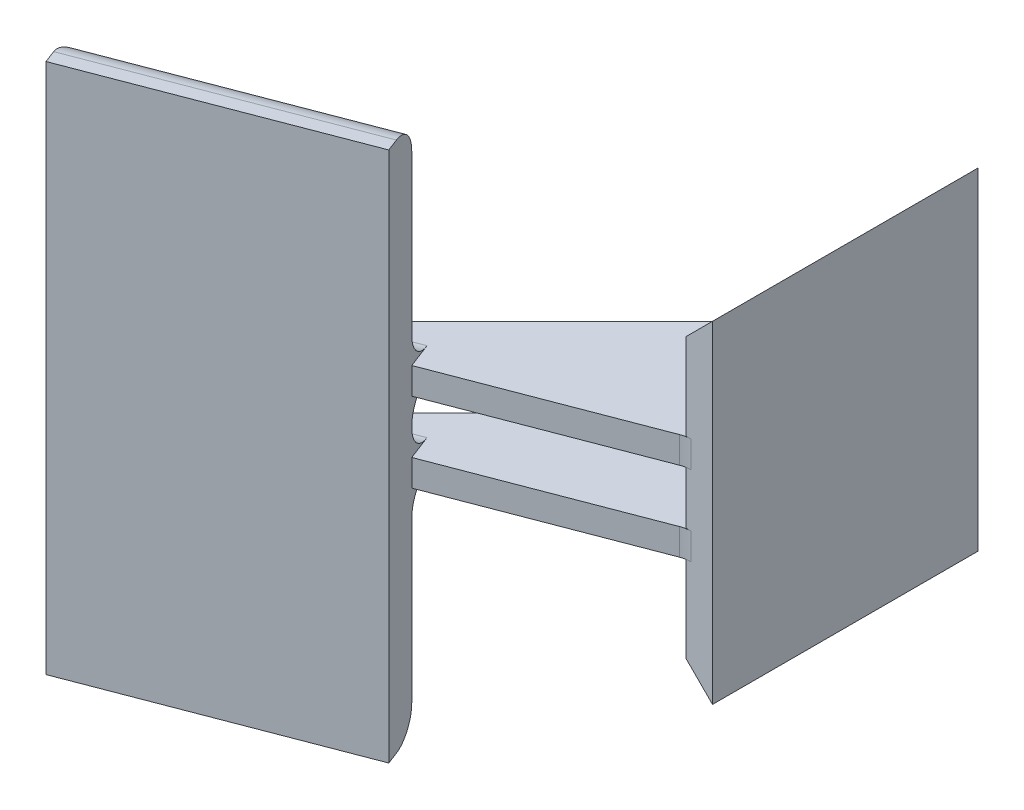
ISO-10303-21;
HEADER;
FILE_DESCRIPTION(('STEP AP214'),'2;1');
FILE_NAME('part.step','',(''),(''),'','','');
FILE_SCHEMA(('AUTOMOTIVE_DESIGN { 1 0 10303 214 1 1 1 1 }'));
ENDSEC;
DATA;
#1=APPLICATION_CONTEXT('core data for automotive mechanical design processes');
#2=APPLICATION_PROTOCOL_DEFINITION('international standard','automotive_design',2000,#1);
#3=PRODUCT_CONTEXT('',#1,'mechanical');
#4=PRODUCT('Part','Part','',(#3));
#5=PRODUCT_RELATED_PRODUCT_CATEGORY('part','',(#4));
#6=PRODUCT_DEFINITION_FORMATION('','',#4);
#7=PRODUCT_DEFINITION_CONTEXT('part definition',#1,'design');
#8=PRODUCT_DEFINITION('design','',#6,#7);
#9=PRODUCT_DEFINITION_SHAPE('','',#8);
#10=(LENGTH_UNIT() NAMED_UNIT(*) SI_UNIT(.MILLI.,.METRE.));
#11=(NAMED_UNIT(*) PLANE_ANGLE_UNIT() SI_UNIT($,.RADIAN.));
#12=(NAMED_UNIT(*) SI_UNIT($,.STERADIAN.) SOLID_ANGLE_UNIT());
#13=UNCERTAINTY_MEASURE_WITH_UNIT(LENGTH_MEASURE(1.E-05),#10,'distance_accuracy_value','');
#14=(GEOMETRIC_REPRESENTATION_CONTEXT(3) GLOBAL_UNCERTAINTY_ASSIGNED_CONTEXT((#13)) GLOBAL_UNIT_ASSIGNED_CONTEXT((#10,
#11,#12)) REPRESENTATION_CONTEXT('',''));
#15=CARTESIAN_POINT('',(0.,0.,0.));
#16=DIRECTION('',(0.,0.,1.));
#17=DIRECTION('',(1.,0.,0.));
#18=AXIS2_PLACEMENT_3D('',#15,#16,#17);
#19=CARTESIAN_POINT('',(0.,4.,10.));
#20=DIRECTION('',(-0.357131166599787,0.,-0.934054243522867));
#21=DIRECTION('',(-0.934054243522867,0.,0.357131166599787));
#22=AXIS2_PLACEMENT_3D('',#19,#20,#21);
#23=PLANE('',#22);
#24=DIRECTION('',(0.934054243522867,0.,-0.357131166599787));
#25=VECTOR('',#24,1.);
#26=CARTESIAN_POINT('',(0.,-4.,10.));
#27=LINE('',#26,#25);
#28=CARTESIAN_POINT('',(-14.9448678963659,-4.,15.7140986655966));
#29=VERTEX_POINT('',#28);
#30=CARTESIAN_POINT('',(-0.344954008165938,-4.,10.1318915129543));
#31=VERTEX_POINT('',#30);
#32=EDGE_CURVE('E306',#29,#31,#27,.T.);
#33=ORIENTED_EDGE('',*,*,#32,.T.);
#34=DIRECTION('',(0.,-1.,0.));
#35=VECTOR('',#34,1.);
#36=CARTESIAN_POINT('',(-0.344954008165938,-2.,10.1318915129543));
#37=LINE('',#36,#35);
#38=CARTESIAN_POINT('',(-0.344954008165938,-2.,10.1318915129543));
#39=VERTEX_POINT('',#38);
#40=EDGE_CURVE('E515',#31,#39,#37,.F.);
#41=ORIENTED_EDGE('',*,*,#40,.T.);
#42=DIRECTION('',(0.934054243522867,0.,-0.357131166599787));
#43=VECTOR('',#42,1.);
#44=CARTESIAN_POINT('',(0.,-2.,10.));
#45=LINE('',#44,#43);
#46=CARTESIAN_POINT('',(-14.9448678963659,-2.,15.7140986655966));
#47=VERTEX_POINT('',#46);
#48=EDGE_CURVE('E287',#47,#39,#45,.T.);
#49=ORIENTED_EDGE('',*,*,#48,.F.);
#50=DIRECTION('',(0.,1.,0.));
#51=VECTOR('',#50,1.);
#52=CARTESIAN_POINT('',(-14.9448678963659,-20.,15.7140986655966));
#53=LINE('',#52,#51);
#54=EDGE_CURVE('E536',#29,#47,#53,.T.);
#55=ORIENTED_EDGE('',*,*,#54,.F.);
#56=EDGE_LOOP('',(#33,#41,#49,#55));
#57=FACE_BOUND('',#56,.T.);
#58=ADVANCED_FACE('F47',(#57),#23,.F.);
#59=DIRECTION('',(0.934054243522867,0.,-0.357131166599787));
#60=VECTOR('',#59,1.);
#61=CARTESIAN_POINT('',(0.,2.,10.));
#62=LINE('',#61,#60);
#63=CARTESIAN_POINT('',(-14.9448678963659,2.,15.7140986655966));
#64=VERTEX_POINT('',#63);
#65=CARTESIAN_POINT('',(-0.344954008165938,2.,10.1318915129543));
#66=VERTEX_POINT('',#65);
#67=EDGE_CURVE('E283',#64,#66,#62,.T.);
#68=ORIENTED_EDGE('',*,*,#67,.T.);
#69=DIRECTION('',(0.,-1.,0.));
#70=VECTOR('',#69,1.);
#71=CARTESIAN_POINT('',(-0.344954008165938,4.,10.1318915129543));
#72=LINE('',#71,#70);
#73=CARTESIAN_POINT('',(-0.344954008165938,4.,10.1318915129543));
#74=VERTEX_POINT('',#73);
#75=EDGE_CURVE('E512',#66,#74,#72,.F.);
#76=ORIENTED_EDGE('',*,*,#75,.T.);
#77=DIRECTION('',(0.934054243522867,0.,-0.357131166599787));
#78=VECTOR('',#77,1.);
#79=CARTESIAN_POINT('',(0.,4.,10.));
#80=LINE('',#79,#78);
#81=CARTESIAN_POINT('',(-14.9448678963659,4.,15.7140986655966));
#82=VERTEX_POINT('',#81);
#83=EDGE_CURVE('E310',#82,#74,#80,.T.);
#84=ORIENTED_EDGE('',*,*,#83,.F.);
#85=EDGE_CURVE('E560',#64,#82,#53,.T.);
#86=ORIENTED_EDGE('',*,*,#85,.F.);
#87=EDGE_LOOP('',(#68,#76,#84,#86));
#88=FACE_BOUND('',#87,.T.);
#89=ADVANCED_FACE('F611',(#88),#23,.F.);
#90=CARTESIAN_POINT('',(0.,4.,-4.99999999999999));
#91=DIRECTION('',(0.707106781186546,0.,0.707106781186549));
#92=DIRECTION('',(0.707106781186549,0.,-0.707106781186546));
#93=AXIS2_PLACEMENT_3D('',#90,#91,#92);
#94=PLANE('',#93);
#95=CARTESIAN_POINT('',(-20.8187436649279,-6.,15.8187436649278));
#96=DIRECTION('',(0.707106781186546,0.,0.707106781186549));
#97=DIRECTION('',(-0.707106781186549,0.,0.707106781186546));
#98=AXIS2_PLACEMENT_3D('',#95,#96,#97);
#99=ELLIPSE('',#98,4.90260701622672,2.);
#100=CARTESIAN_POINT('',(-20.8187436649279,-4.,15.8187436649278));
#101=VERTEX_POINT('',#100);
#102=CARTESIAN_POINT('',(-23.9838309903863,-5.18410756016937,18.9838309903863));
#103=VERTEX_POINT('',#102);
#104=EDGE_CURVE('E433',#101,#103,#99,.T.);
#105=ORIENTED_EDGE('',*,*,#104,.T.);
#106=DIRECTION('',(0.,-1.,0.));
#107=VECTOR('',#106,1.);
#108=CARTESIAN_POINT('',(-23.9838309903863,-2.,18.9838309903863));
#109=LINE('',#108,#107);
#110=CARTESIAN_POINT('',(-23.9838309903863,-0.815892439830626,18.9838309903863));
#111=VERTEX_POINT('',#110);
#112=EDGE_CURVE('E407',#103,#111,#109,.F.);
#113=ORIENTED_EDGE('',*,*,#112,.T.);
#114=CARTESIAN_POINT('',(-20.8187436649279,0.,15.8187436649278));
#115=DIRECTION('',(0.707106781186546,0.,0.707106781186549));
#116=DIRECTION('',(0.707106781186549,0.,-0.707106781186546));
#117=AXIS2_PLACEMENT_3D('',#114,#115,#116);
#118=ELLIPSE('',#117,4.90260701622672,2.);
#119=CARTESIAN_POINT('',(-20.8187436649279,-2.,15.8187436649278));
#120=VERTEX_POINT('',#119);
#121=EDGE_CURVE('E440',#111,#120,#118,.T.);
#122=ORIENTED_EDGE('',*,*,#121,.T.);
#123=DIRECTION('',(-0.707106781186549,0.,0.707106781186546));
#124=VECTOR('',#123,1.);
#125=CARTESIAN_POINT('',(0.,-2.,-4.99999999999999));
#126=LINE('',#125,#124);
#127=CARTESIAN_POINT('',(0.,-2.,-4.99999999999999));
#128=VERTEX_POINT('',#127);
#129=EDGE_CURVE('E282',#128,#120,#126,.T.);
#130=ORIENTED_EDGE('',*,*,#129,.F.);
#131=DIRECTION('',(0.,-1.,0.));
#132=VECTOR('',#131,1.);
#133=CARTESIAN_POINT('',(0.,4.,-4.99999999999999));
#134=LINE('',#133,#132);
#135=CARTESIAN_POINT('',(0.,-4.,-4.99999999999999));
#136=VERTEX_POINT('',#135);
#137=EDGE_CURVE('E314',#128,#136,#134,.T.);
#138=ORIENTED_EDGE('',*,*,#137,.T.);
#139=DIRECTION('',(-0.707106781186549,0.,0.707106781186546));
#140=VECTOR('',#139,1.);
#141=CARTESIAN_POINT('',(0.,-4.,-4.99999999999999));
#142=LINE('',#141,#140);
#143=EDGE_CURVE('E318',#136,#101,#142,.T.);
#144=ORIENTED_EDGE('',*,*,#143,.T.);
#145=EDGE_LOOP('',(#105,#113,#122,#130,#138,#144));
#146=FACE_BOUND('',#145,.T.);
#147=ADVANCED_FACE('F550',(#146),#94,.F.);
#148=CARTESIAN_POINT('',(2.,-12.5,9.99999999999999));
#149=DIRECTION('',(0.,0.,-1.));
#150=DIRECTION('',(-1.,0.,0.));
#151=AXIS2_PLACEMENT_3D('',#148,#149,#150);
#152=PLANE('',#151);
#153=DIRECTION('',(0.,-1.,0.));
#154=VECTOR('',#153,1.);
#155=CARTESIAN_POINT('',(0.369308325033637,2.,9.99999999999999));
#156=LINE('',#155,#154);
#157=CARTESIAN_POINT('',(0.369308325033637,4.,9.99999999999999));
#158=VERTEX_POINT('',#157);
#159=CARTESIAN_POINT('',(0.369308325033637,2.,9.99999999999999));
#160=VERTEX_POINT('',#159);
#161=EDGE_CURVE('E505',#158,#160,#156,.T.);
#162=ORIENTED_EDGE('',*,*,#161,.T.);
#163=DIRECTION('',(-1.,0.,0.));
#164=VECTOR('',#163,1.);
#165=CARTESIAN_POINT('',(0.,2.,9.99999999999999));
#166=LINE('',#165,#164);
#167=CARTESIAN_POINT('',(0.,2.,10.));
#168=VERTEX_POINT('',#167);
#169=EDGE_CURVE('E509',#160,#168,#166,.T.);
#170=ORIENTED_EDGE('',*,*,#169,.T.);
#171=DIRECTION('',(0.,1.,0.));
#172=VECTOR('',#171,1.);
#173=CARTESIAN_POINT('',(0.,-2.,10.));
#174=LINE('',#173,#172);
#175=CARTESIAN_POINT('',(0.,-2.,10.));
#176=VERTEX_POINT('',#175);
#177=EDGE_CURVE('E290',#176,#168,#174,.T.);
#178=ORIENTED_EDGE('',*,*,#177,.F.);
#179=DIRECTION('',(1.,0.,0.));
#180=VECTOR('',#179,1.);
#181=CARTESIAN_POINT('',(2.,-2.,9.99999999999999));
#182=LINE('',#181,#180);
#183=CARTESIAN_POINT('',(0.369308325033637,-2.,9.99999999999999));
#184=VERTEX_POINT('',#183);
#185=EDGE_CURVE('E62',#176,#184,#182,.T.);
#186=ORIENTED_EDGE('',*,*,#185,.T.);
#187=DIRECTION('',(0.,-1.,0.));
#188=VECTOR('',#187,1.);
#189=CARTESIAN_POINT('',(0.369308325033637,-4.,9.99999999999999));
#190=LINE('',#189,#188);
#191=CARTESIAN_POINT('',(0.369308325033637,-4.,9.99999999999999));
#192=VERTEX_POINT('',#191);
#193=EDGE_CURVE('E496',#184,#192,#190,.T.);
#194=ORIENTED_EDGE('',*,*,#193,.T.);
#195=DIRECTION('',(-1.,0.,0.));
#196=VECTOR('',#195,1.);
#197=CARTESIAN_POINT('',(0.,-4.,9.99999999999999));
#198=LINE('',#197,#196);
#199=CARTESIAN_POINT('',(0.,-4.,9.99999999999999));
#200=VERTEX_POINT('',#199);
#201=EDGE_CURVE('E500',#192,#200,#198,.T.);
#202=ORIENTED_EDGE('',*,*,#201,.T.);
#203=DIRECTION('',(0.,-1.,0.));
#204=VECTOR('',#203,1.);
#205=CARTESIAN_POINT('',(0.,-12.5,9.99999999999999));
#206=LINE('',#205,#204);
#207=CARTESIAN_POINT('',(0.,-10.5,9.99999999999999));
#208=VERTEX_POINT('',#207);
#209=EDGE_CURVE('E329',#200,#208,#206,.T.);
#210=ORIENTED_EDGE('',*,*,#209,.T.);
#211=DIRECTION('',(-0.707106781186546,0.707106781186549,0.));
#212=VECTOR('',#211,1.);
#213=CARTESIAN_POINT('',(1.99999999999999,-12.5,9.99999999999999));
#214=LINE('',#213,#212);
#215=CARTESIAN_POINT('',(2.,-12.5,9.99999999999999));
#216=VERTEX_POINT('',#215);
#217=EDGE_CURVE('E485',#208,#216,#214,.F.);
#218=ORIENTED_EDGE('',*,*,#217,.T.);
#219=DIRECTION('',(0.,-1.,0.));
#220=VECTOR('',#219,1.);
#221=CARTESIAN_POINT('',(2.,-12.5,9.99999999999999));
#222=LINE('',#221,#220);
#223=CARTESIAN_POINT('',(2.,12.5,9.99999999999999));
#224=VERTEX_POINT('',#223);
#225=EDGE_CURVE('E334',#224,#216,#222,.T.);
#226=ORIENTED_EDGE('',*,*,#225,.F.);
#227=DIRECTION('',(0.707106781186546,0.707106781186549,0.));
#228=VECTOR('',#227,1.);
#229=CARTESIAN_POINT('',(1.99999999999999,12.5,9.99999999999999));
#230=LINE('',#229,#228);
#231=CARTESIAN_POINT('',(0.,10.5,9.99999999999999));
#232=VERTEX_POINT('',#231);
#233=EDGE_CURVE('E482',#224,#232,#230,.F.);
#234=ORIENTED_EDGE('',*,*,#233,.T.);
#235=CARTESIAN_POINT('',(0.,4.,9.99999999999999));
#236=VERTEX_POINT('',#235);
#237=EDGE_CURVE('E335',#232,#236,#206,.T.);
#238=ORIENTED_EDGE('',*,*,#237,.T.);
#239=DIRECTION('',(1.,0.,0.));
#240=VECTOR('',#239,1.);
#241=CARTESIAN_POINT('',(2.,4.,9.99999999999999));
#242=LINE('',#241,#240);
#243=EDGE_CURVE('E70',#236,#158,#242,.T.);
#244=ORIENTED_EDGE('',*,*,#243,.T.);
#245=EDGE_LOOP('',(#162,#170,#178,#186,#194,#202,#210,#218,#226,#234,#238,#244));
#246=FACE_BOUND('',#245,.T.);
#247=ADVANCED_FACE('F540',(#246),#152,.F.);
#248=CARTESIAN_POINT('',(2.,0.,0.));
#249=DIRECTION('',(1.,0.,0.));
#250=DIRECTION('',(0.,0.,-1.));
#251=AXIS2_PLACEMENT_3D('',#248,#249,#250);
#252=PLANE('',#251);
#253=DIRECTION('',(0.,0.,1.));
#254=VECTOR('',#253,1.);
#255=CARTESIAN_POINT('',(2.,12.5,9.99999999999999));
#256=LINE('',#255,#254);
#257=CARTESIAN_POINT('',(2.,12.5,-10.));
#258=VERTEX_POINT('',#257);
#259=EDGE_CURVE('E330',#258,#224,#256,.T.);
#260=ORIENTED_EDGE('',*,*,#259,.T.);
#261=ORIENTED_EDGE('',*,*,#225,.T.);
#262=DIRECTION('',(0.,0.,-1.));
#263=VECTOR('',#262,1.);
#264=CARTESIAN_POINT('',(2.,-12.5,9.99999999999999));
#265=LINE('',#264,#263);
#266=CARTESIAN_POINT('',(2.,-12.5,-10.));
#267=VERTEX_POINT('',#266);
#268=EDGE_CURVE('E339',#216,#267,#265,.T.);
#269=ORIENTED_EDGE('',*,*,#268,.T.);
#270=DIRECTION('',(0.,1.,0.));
#271=VECTOR('',#270,1.);
#272=CARTESIAN_POINT('',(2.,-12.5,-10.));
#273=LINE('',#272,#271);
#274=EDGE_CURVE('E343',#267,#258,#273,.T.);
#275=ORIENTED_EDGE('',*,*,#274,.T.);
#276=EDGE_LOOP('',(#260,#261,#269,#275));
#277=FACE_BOUND('',#276,.T.);
#278=ADVANCED_FACE('F626',(#277),#252,.T.);
#279=CARTESIAN_POINT('',(0.,0.,0.));
#280=DIRECTION('',(1.,0.,0.));
#281=DIRECTION('',(0.,0.,-1.));
#282=AXIS2_PLACEMENT_3D('',#279,#280,#281);
#283=PLANE('',#282);
#284=DIRECTION('',(0.,-1.,0.));
#285=VECTOR('',#284,1.);
#286=CARTESIAN_POINT('',(0.,0.,-8.00000000000001));
#287=LINE('',#286,#285);
#288=CARTESIAN_POINT('',(0.,10.5,-8.00000000000001));
#289=VERTEX_POINT('',#288);
#290=CARTESIAN_POINT('',(0.,-10.5,-8.00000000000001));
#291=VERTEX_POINT('',#290);
#292=EDGE_CURVE('E476',#289,#291,#287,.T.);
#293=ORIENTED_EDGE('',*,*,#292,.T.);
#294=DIRECTION('',(0.,0.,1.));
#295=VECTOR('',#294,1.);
#296=CARTESIAN_POINT('',(0.,-10.5,0.));
#297=LINE('',#296,#295);
#298=EDGE_CURVE('E479',#291,#208,#297,.T.);
#299=ORIENTED_EDGE('',*,*,#298,.T.);
#300=ORIENTED_EDGE('',*,*,#209,.F.);
#301=DIRECTION('',(0.,0.,-1.));
#302=VECTOR('',#301,1.);
#303=CARTESIAN_POINT('',(0.,-4.,10.));
#304=LINE('',#303,#302);
#305=EDGE_CURVE('E301',#200,#136,#304,.T.);
#306=ORIENTED_EDGE('',*,*,#305,.T.);
#307=ORIENTED_EDGE('',*,*,#137,.F.);
#308=DIRECTION('',(0.,0.,-1.));
#309=VECTOR('',#308,1.);
#310=CARTESIAN_POINT('',(0.,-2.,10.));
#311=LINE('',#310,#309);
#312=EDGE_CURVE('E279',#176,#128,#311,.T.);
#313=ORIENTED_EDGE('',*,*,#312,.F.);
#314=ORIENTED_EDGE('',*,*,#177,.T.);
#315=DIRECTION('',(0.,0.,-1.));
#316=VECTOR('',#315,1.);
#317=CARTESIAN_POINT('',(0.,2.,10.));
#318=LINE('',#317,#316);
#319=CARTESIAN_POINT('',(0.,2.,-4.99999999999999));
#320=VERTEX_POINT('',#319);
#321=EDGE_CURVE('E268',#168,#320,#318,.T.);
#322=ORIENTED_EDGE('',*,*,#321,.T.);
#323=CARTESIAN_POINT('',(0.,4.,-4.99999999999999));
#324=VERTEX_POINT('',#323);
#325=EDGE_CURVE('E325',#324,#320,#134,.T.);
#326=ORIENTED_EDGE('',*,*,#325,.F.);
#327=DIRECTION('',(0.,0.,-1.));
#328=VECTOR('',#327,1.);
#329=CARTESIAN_POINT('',(0.,4.,10.));
#330=LINE('',#329,#328);
#331=EDGE_CURVE('E302',#236,#324,#330,.T.);
#332=ORIENTED_EDGE('',*,*,#331,.F.);
#333=ORIENTED_EDGE('',*,*,#237,.F.);
#334=DIRECTION('',(0.,0.,-1.));
#335=VECTOR('',#334,1.);
#336=CARTESIAN_POINT('',(0.,10.5,0.));
#337=LINE('',#336,#335);
#338=EDGE_CURVE('E443',#232,#289,#337,.T.);
#339=ORIENTED_EDGE('',*,*,#338,.T.);
#340=EDGE_LOOP('',(#293,#299,#300,#306,#307,#313,#314,#322,#326,#332,#333,#339));
#341=FACE_BOUND('',#340,.T.);
#342=ADVANCED_FACE('F546',(#341),#283,.F.);
#343=DIRECTION('',(-0.707106781186549,0.,0.707106781186546));
#344=VECTOR('',#343,1.);
#345=CARTESIAN_POINT('',(0.,2.,-4.99999999999999));
#346=LINE('',#345,#344);
#347=CARTESIAN_POINT('',(-20.8187436649279,2.,15.8187436649278));
#348=VERTEX_POINT('',#347);
#349=EDGE_CURVE('E273',#320,#348,#346,.T.);
#350=ORIENTED_EDGE('',*,*,#349,.T.);
#351=CARTESIAN_POINT('',(-20.8187436649279,0.,15.8187436649278));
#352=DIRECTION('',(0.707106781186546,0.,0.707106781186549));
#353=DIRECTION('',(-0.707106781186549,0.,0.707106781186546));
#354=AXIS2_PLACEMENT_3D('',#351,#352,#353);
#355=ELLIPSE('',#354,4.90260701622672,2.);
#356=CARTESIAN_POINT('',(-23.9838309903863,0.815892439830626,18.9838309903863));
#357=VERTEX_POINT('',#356);
#358=EDGE_CURVE('E426',#348,#357,#355,.T.);
#359=ORIENTED_EDGE('',*,*,#358,.T.);
#360=DIRECTION('',(0.,-1.,0.));
#361=VECTOR('',#360,1.);
#362=CARTESIAN_POINT('',(-23.9838309903863,4.,18.9838309903863));
#363=LINE('',#362,#361);
#364=CARTESIAN_POINT('',(-23.9838309903863,5.18410756016937,18.9838309903863));
#365=VERTEX_POINT('',#364);
#366=EDGE_CURVE('E390',#357,#365,#363,.F.);
#367=ORIENTED_EDGE('',*,*,#366,.T.);
#368=CARTESIAN_POINT('',(-20.8187436649279,6.,15.8187436649278));
#369=DIRECTION('',(0.707106781186546,0.,0.707106781186549));
#370=DIRECTION('',(0.707106781186549,0.,-0.707106781186546));
#371=AXIS2_PLACEMENT_3D('',#368,#369,#370);
#372=ELLIPSE('',#371,4.90260701622672,2.);
#373=CARTESIAN_POINT('',(-20.8187436649279,4.,15.8187436649278));
#374=VERTEX_POINT('',#373);
#375=EDGE_CURVE('E420',#365,#374,#372,.T.);
#376=ORIENTED_EDGE('',*,*,#375,.T.);
#377=DIRECTION('',(-0.707106781186549,0.,0.707106781186546));
#378=VECTOR('',#377,1.);
#379=CARTESIAN_POINT('',(0.,4.,-4.99999999999999));
#380=LINE('',#379,#378);
#381=EDGE_CURVE('E305',#324,#374,#380,.T.);
#382=ORIENTED_EDGE('',*,*,#381,.F.);
#383=ORIENTED_EDGE('',*,*,#325,.T.);
#384=EDGE_LOOP('',(#350,#359,#367,#376,#382,#383));
#385=FACE_BOUND('',#384,.T.);
#386=ADVANCED_FACE('F621',(#385),#94,.F.);
#387=CARTESIAN_POINT('',(0.,4.,0.));
#388=DIRECTION('',(0.,1.,0.));
#389=DIRECTION('',(0.,0.,1.));
#390=AXIS2_PLACEMENT_3D('',#387,#388,#389);
#391=PLANE('',#390);
#392=ORIENTED_EDGE('',*,*,#381,.T.);
#393=DIRECTION('',(0.934054243522867,0.,-0.357131166599787));
#394=VECTOR('',#393,1.);
#395=CARTESIAN_POINT('',(2.62153648336846,4.,6.85646481138502));
#396=LINE('',#395,#394);
#397=CARTESIAN_POINT('',(-15.6591302295654,4.,13.8459901785509));
#398=VERTEX_POINT('',#397);
#399=EDGE_CURVE('E386',#374,#398,#396,.T.);
#400=ORIENTED_EDGE('',*,*,#399,.T.);
#401=DIRECTION('',(0.357131166599787,0.,0.934054243522867));
#402=VECTOR('',#401,1.);
#403=CARTESIAN_POINT('',(-18.2806667129339,4.,6.98952536716585));
#404=LINE('',#403,#402);
#405=EDGE_CURVE('E383',#398,#82,#404,.T.);
#406=ORIENTED_EDGE('',*,*,#405,.T.);
#407=ORIENTED_EDGE('',*,*,#83,.T.);
#408=CARTESIAN_POINT('',(0.369308325033637,4.,12.));
#409=DIRECTION('',(0.,1.,0.));
#410=DIRECTION('',(0.,0.,1.));
#411=AXIS2_PLACEMENT_3D('',#408,#409,#410);
#412=CIRCLE('',#411,2.);
#413=EDGE_CURVE('E521',#74,#158,#412,.F.);
#414=ORIENTED_EDGE('',*,*,#413,.T.);
#415=ORIENTED_EDGE('',*,*,#243,.F.);
#416=ORIENTED_EDGE('',*,*,#331,.T.);
#417=EDGE_LOOP('',(#392,#400,#406,#407,#414,#415,#416));
#418=FACE_BOUND('',#417,.T.);
#419=ADVANCED_FACE('F624',(#418),#391,.T.);
#420=CARTESIAN_POINT('',(0.,-4.,0.));
#421=DIRECTION('',(0.,1.,0.));
#422=DIRECTION('',(0.,0.,1.));
#423=AXIS2_PLACEMENT_3D('',#420,#421,#422);
#424=PLANE('',#423);
#425=ORIENTED_EDGE('',*,*,#32,.F.);
#426=DIRECTION('',(-0.357131166599787,0.,-0.934054243522867));
#427=VECTOR('',#426,1.);
#428=CARTESIAN_POINT('',(-13.8734743965665,-4.,18.5162613961652));
#429=LINE('',#428,#427);
#430=CARTESIAN_POINT('',(-15.6591302295654,-4.,13.8459901785509));
#431=VERTEX_POINT('',#430);
#432=EDGE_CURVE('E403',#29,#431,#429,.T.);
#433=ORIENTED_EDGE('',*,*,#432,.T.);
#434=DIRECTION('',(0.934054243522867,0.,-0.357131166599787));
#435=VECTOR('',#434,1.);
#436=CARTESIAN_POINT('',(-24.9996726647941,-4.,17.4173018445487));
#437=LINE('',#436,#435);
#438=EDGE_CURVE('E400',#431,#101,#437,.F.);
#439=ORIENTED_EDGE('',*,*,#438,.T.);
#440=ORIENTED_EDGE('',*,*,#143,.F.);
#441=ORIENTED_EDGE('',*,*,#305,.F.);
#442=ORIENTED_EDGE('',*,*,#201,.F.);
#443=CARTESIAN_POINT('',(0.369308325033637,-4.,12.));
#444=DIRECTION('',(0.,1.,0.));
#445=DIRECTION('',(0.,0.,1.));
#446=AXIS2_PLACEMENT_3D('',#443,#444,#445);
#447=CIRCLE('',#446,2.);
#448=EDGE_CURVE('E56',#192,#31,#447,.T.);
#449=ORIENTED_EDGE('',*,*,#448,.T.);
#450=EDGE_LOOP('',(#425,#433,#439,#440,#441,#442,#449));
#451=FACE_BOUND('',#450,.T.);
#452=ADVANCED_FACE('F527',(#451),#424,.F.);
#453=CARTESIAN_POINT('',(0.,-2.,0.));
#454=DIRECTION('',(0.,1.,0.));
#455=DIRECTION('',(0.,0.,1.));
#456=AXIS2_PLACEMENT_3D('',#453,#454,#455);
#457=PLANE('',#456);
#458=ORIENTED_EDGE('',*,*,#129,.T.);
#459=DIRECTION('',(0.934054243522867,0.,-0.357131166599787));
#460=VECTOR('',#459,1.);
#461=CARTESIAN_POINT('',(2.62153648336846,-2.,6.85646481138502));
#462=LINE('',#461,#460);
#463=CARTESIAN_POINT('',(-15.6591302295654,-2.,13.8459901785509));
#464=VERTEX_POINT('',#463);
#465=EDGE_CURVE('E413',#120,#464,#462,.T.);
#466=ORIENTED_EDGE('',*,*,#465,.T.);
#467=DIRECTION('',(0.357131166599787,0.,0.934054243522867));
#468=VECTOR('',#467,1.);
#469=CARTESIAN_POINT('',(-18.2806667129339,-2.,6.98952536716585));
#470=LINE('',#469,#468);
#471=EDGE_CURVE('E410',#464,#47,#470,.T.);
#472=ORIENTED_EDGE('',*,*,#471,.T.);
#473=ORIENTED_EDGE('',*,*,#48,.T.);
#474=CARTESIAN_POINT('',(0.369308325033637,-2.,12.));
#475=DIRECTION('',(0.,1.,0.));
#476=DIRECTION('',(0.,0.,1.));
#477=AXIS2_PLACEMENT_3D('',#474,#475,#476);
#478=CIRCLE('',#477,2.);
#479=EDGE_CURVE('E11',#39,#184,#478,.F.);
#480=ORIENTED_EDGE('',*,*,#479,.T.);
#481=ORIENTED_EDGE('',*,*,#185,.F.);
#482=ORIENTED_EDGE('',*,*,#312,.T.);
#483=EDGE_LOOP('',(#458,#466,#472,#473,#480,#481,#482));
#484=FACE_BOUND('',#483,.T.);
#485=ADVANCED_FACE('F538',(#484),#457,.T.);
#486=CARTESIAN_POINT('',(0.,2.,0.));
#487=DIRECTION('',(0.,1.,0.));
#488=DIRECTION('',(0.,0.,1.));
#489=AXIS2_PLACEMENT_3D('',#486,#487,#488);
#490=PLANE('',#489);
#491=ORIENTED_EDGE('',*,*,#67,.F.);
#492=DIRECTION('',(-0.357131166599787,0.,-0.934054243522867));
#493=VECTOR('',#492,1.);
#494=CARTESIAN_POINT('',(-13.8734743965665,2.,18.5162613961652));
#495=LINE('',#494,#493);
#496=CARTESIAN_POINT('',(-15.6591302295654,2.,13.8459901785509));
#497=VERTEX_POINT('',#496);
#498=EDGE_CURVE('E396',#64,#497,#495,.T.);
#499=ORIENTED_EDGE('',*,*,#498,.T.);
#500=DIRECTION('',(0.934054243522867,0.,-0.357131166599787));
#501=VECTOR('',#500,1.);
#502=CARTESIAN_POINT('',(-24.9996726647941,2.,17.4173018445487));
#503=LINE('',#502,#501);
#504=EDGE_CURVE('E393',#497,#348,#503,.F.);
#505=ORIENTED_EDGE('',*,*,#504,.T.);
#506=ORIENTED_EDGE('',*,*,#349,.F.);
#507=ORIENTED_EDGE('',*,*,#321,.F.);
#508=ORIENTED_EDGE('',*,*,#169,.F.);
#509=CARTESIAN_POINT('',(0.369308325033637,2.,12.));
#510=DIRECTION('',(0.,1.,0.));
#511=DIRECTION('',(0.,0.,1.));
#512=AXIS2_PLACEMENT_3D('',#509,#510,#511);
#513=CIRCLE('',#512,2.);
#514=EDGE_CURVE('E518',#160,#66,#513,.T.);
#515=ORIENTED_EDGE('',*,*,#514,.T.);
#516=EDGE_LOOP('',(#491,#499,#505,#506,#507,#508,#515));
#517=FACE_BOUND('',#516,.T.);
#518=ADVANCED_FACE('F658',(#517),#490,.F.);
#519=CARTESIAN_POINT('',(3.33579881656803,0.,8.72457329843075));
#520=DIRECTION('',(0.357131166599787,0.,0.934054243522867));
#521=DIRECTION('',(0.934054243522867,0.,-0.357131166599787));
#522=AXIS2_PLACEMENT_3D('',#519,#520,#521);
#523=PLANE('',#522);
#524=CARTESIAN_POINT('',(-14.9448678963659,-18.,15.7140986655966));
#525=VERTEX_POINT('',#524);
#526=CARTESIAN_POINT('',(-14.9448678963659,-6.,15.7140986655966));
#527=VERTEX_POINT('',#526);
#528=EDGE_CURVE('E262',#525,#527,#53,.T.);
#529=ORIENTED_EDGE('',*,*,#528,.F.);
#530=DIRECTION('',(0.934054243522867,0.,-0.357131166599787));
#531=VECTOR('',#530,1.);
#532=CARTESIAN_POINT('',(3.33579881656804,-18.,8.72457329843075));
#533=LINE('',#532,#531);
#534=CARTESIAN_POINT('',(-31.7578442797775,-18.,22.1424596643928));
#535=VERTEX_POINT('',#534);
#536=EDGE_CURVE('E375',#525,#535,#533,.F.);
#537=ORIENTED_EDGE('',*,*,#536,.T.);
#538=DIRECTION('',(0.,-1.,0.));
#539=VECTOR('',#538,1.);
#540=CARTESIAN_POINT('',(-31.7578442797775,0.,22.1424596643928));
#541=LINE('',#540,#539);
#542=CARTESIAN_POINT('',(-31.7578442797775,18.,22.1424596643928));
#543=VERTEX_POINT('',#542);
#544=EDGE_CURVE('E372',#535,#543,#541,.F.);
#545=ORIENTED_EDGE('',*,*,#544,.T.);
#546=DIRECTION('',(-0.934054243522867,0.,0.357131166599787));
#547=VECTOR('',#546,1.);
#548=CARTESIAN_POINT('',(3.33579881656804,18.,8.72457329843075));
#549=LINE('',#548,#547);
#550=CARTESIAN_POINT('',(-14.9448678963659,18.,15.7140986655966));
#551=VERTEX_POINT('',#550);
#552=EDGE_CURVE('E369',#543,#551,#549,.F.);
#553=ORIENTED_EDGE('',*,*,#552,.T.);
#554=CARTESIAN_POINT('',(-14.9448678963659,6.,15.7140986655966));
#555=VERTEX_POINT('',#554);
#556=EDGE_CURVE('E453',#555,#551,#53,.T.);
#557=ORIENTED_EDGE('',*,*,#556,.F.);
#558=DIRECTION('',(0.934054243522867,0.,-0.357131166599787));
#559=VECTOR('',#558,1.);
#560=CARTESIAN_POINT('',(3.33579881656803,6.,8.72457329843075));
#561=LINE('',#560,#559);
#562=CARTESIAN_POINT('',(-24.6837822195599,6.,19.4377259150589));
#563=VERTEX_POINT('',#562);
#564=EDGE_CURVE('E366',#555,#563,#561,.F.);
#565=ORIENTED_EDGE('',*,*,#564,.T.);
#566=DIRECTION('',(0.,-1.,0.));
#567=VECTOR('',#566,1.);
#568=CARTESIAN_POINT('',(-24.6837822195599,2.,19.4377259150589));
#569=LINE('',#568,#567);
#570=CARTESIAN_POINT('',(-24.6837822195599,0.,19.4377259150589));
#571=VERTEX_POINT('',#570);
#572=EDGE_CURVE('E363',#563,#571,#569,.T.);
#573=ORIENTED_EDGE('',*,*,#572,.T.);
#574=DIRECTION('',(0.,-1.,0.));
#575=VECTOR('',#574,1.);
#576=CARTESIAN_POINT('',(-24.6837822195599,-4.,19.4377259150589));
#577=LINE('',#576,#575);
#578=CARTESIAN_POINT('',(-24.6837822195599,-6.,19.4377259150589));
#579=VERTEX_POINT('',#578);
#580=EDGE_CURVE('E357',#571,#579,#577,.T.);
#581=ORIENTED_EDGE('',*,*,#580,.T.);
#582=DIRECTION('',(0.934054243522867,0.,-0.357131166599787));
#583=VECTOR('',#582,1.);
#584=CARTESIAN_POINT('',(-14.9448678963659,-6.,15.7140986655966));
#585=LINE('',#584,#583);
#586=EDGE_CURVE('E360',#579,#527,#585,.T.);
#587=ORIENTED_EDGE('',*,*,#586,.T.);
#588=EDGE_LOOP('',(#529,#537,#545,#553,#557,#565,#573,#581,#587));
#589=FACE_BOUND('',#588,.T.);
#590=ADVANCED_FACE('F595',(#589),#523,.F.);
#591=CARTESIAN_POINT('',(-32.5545592670238,-20.,25.6588847281609));
#592=DIRECTION('',(0.934054243522867,0.,-0.357131166599787));
#593=DIRECTION('',(-0.357131166599787,0.,-0.934054243522867));
#594=AXIS2_PLACEMENT_3D('',#591,#592,#593);
#595=PLANE('',#594);
#596=DIRECTION('',(-0.357131166599787,0.,-0.934054243522867));
#597=VECTOR('',#596,1.);
#598=CARTESIAN_POINT('',(-32.5545592670238,20.,25.6588847281609));
#599=LINE('',#598,#597);
#600=CARTESIAN_POINT('',(-32.5545592670238,20.,25.6588847281609));
#601=VERTEX_POINT('',#600);
#602=CARTESIAN_POINT('',(-32.9116904336236,20.,24.7248304846381));
#603=VERTEX_POINT('',#602);
#604=EDGE_CURVE('E584',#601,#603,#599,.T.);
#605=ORIENTED_EDGE('',*,*,#604,.T.);
#606=DIRECTION('',(0.,-1.,0.));
#607=VECTOR('',#606,1.);
#608=CARTESIAN_POINT('',(-32.9116904336236,-20.,24.7248304846381));
#609=LINE('',#608,#607);
#610=CARTESIAN_POINT('',(-32.9116904336236,-20.,24.7248304846381));
#611=VERTEX_POINT('',#610);
#612=EDGE_CURVE('E266',#603,#611,#609,.T.);
#613=ORIENTED_EDGE('',*,*,#612,.T.);
#614=DIRECTION('',(-0.357131166599787,0.,-0.934054243522867));
#615=VECTOR('',#614,1.);
#616=CARTESIAN_POINT('',(-32.5545592670238,-20.,25.6588847281609));
#617=LINE('',#616,#615);
#618=CARTESIAN_POINT('',(-32.5545592670238,-20.,25.6588847281609));
#619=VERTEX_POINT('',#618);
#620=EDGE_CURVE('E244',#619,#611,#617,.T.);
#621=ORIENTED_EDGE('',*,*,#620,.F.);
#622=DIRECTION('',(0.,-1.,0.));
#623=VECTOR('',#622,1.);
#624=CARTESIAN_POINT('',(-32.5545592670238,-20.,25.6588847281609));
#625=LINE('',#624,#623);
#626=EDGE_CURVE('E252',#601,#619,#625,.T.);
#627=ORIENTED_EDGE('',*,*,#626,.F.);
#628=EDGE_LOOP('',(#605,#613,#621,#627));
#629=FACE_BOUND('',#628,.T.);
#630=ADVANCED_FACE('F264',(#629),#595,.F.);
#631=CARTESIAN_POINT('',(-13.8734743965665,-20.,18.5162613961652));
#632=DIRECTION('',(0.,1.,0.));
#633=DIRECTION('',(-1.,0.,0.));
#634=AXIS2_PLACEMENT_3D('',#631,#632,#633);
#635=PLANE('',#634);
#636=ORIENTED_EDGE('',*,*,#620,.T.);
#637=DIRECTION('',(0.934054243522867,0.,-0.357131166599787));
#638=VECTOR('',#637,1.);
#639=CARTESIAN_POINT('',(-14.2306055631663,-20.,17.5822071526423));
#640=LINE('',#639,#638);
#641=CARTESIAN_POINT('',(-14.2306055631663,-20.,17.5822071526423));
#642=VERTEX_POINT('',#641);
#643=EDGE_CURVE('E346',#611,#642,#640,.T.);
#644=ORIENTED_EDGE('',*,*,#643,.T.);
#645=DIRECTION('',(-0.357131166599787,0.,-0.934054243522867));
#646=VECTOR('',#645,1.);
#647=CARTESIAN_POINT('',(-13.8734743965665,-20.,18.5162613961652));
#648=LINE('',#647,#646);
#649=CARTESIAN_POINT('',(-13.8734743965665,-20.,18.5162613961652));
#650=VERTEX_POINT('',#649);
#651=EDGE_CURVE('E247',#650,#642,#648,.T.);
#652=ORIENTED_EDGE('',*,*,#651,.F.);
#653=DIRECTION('',(0.934054243522867,0.,-0.357131166599787));
#654=VECTOR('',#653,1.);
#655=CARTESIAN_POINT('',(-13.8734743965665,-20.,18.5162613961652));
#656=LINE('',#655,#654);
#657=EDGE_CURVE('E239',#619,#650,#656,.T.);
#658=ORIENTED_EDGE('',*,*,#657,.F.);
#659=EDGE_LOOP('',(#636,#644,#652,#658));
#660=FACE_BOUND('',#659,.T.);
#661=ADVANCED_FACE('F241',(#660),#635,.F.);
#662=CARTESIAN_POINT('',(-13.8734743965665,-20.,18.5162613961652));
#663=DIRECTION('',(-0.934054243522867,0.,0.357131166599787));
#664=DIRECTION('',(0.357131166599787,0.,0.934054243522867));
#665=AXIS2_PLACEMENT_3D('',#662,#663,#664);
#666=PLANE('',#665);
#667=ORIENTED_EDGE('',*,*,#651,.T.);
#668=CARTESIAN_POINT('',(-14.2306055631663,-18.,17.5822071526423));
#669=DIRECTION('',(-0.934054243522867,0.,0.357131166599787));
#670=DIRECTION('',(0.357131166599787,0.,0.934054243522867));
#671=AXIS2_PLACEMENT_3D('',#668,#669,#670);
#672=CIRCLE('',#671,2.);
#673=EDGE_CURVE('E354',#642,#525,#672,.F.);
#674=ORIENTED_EDGE('',*,*,#673,.T.);
#675=ORIENTED_EDGE('',*,*,#528,.T.);
#676=CARTESIAN_POINT('',(-15.6591302295654,-6.,13.8459901785509));
#677=DIRECTION('',(-0.934054243522867,0.,0.357131166599787));
#678=DIRECTION('',(0.357131166599787,0.,0.934054243522867));
#679=AXIS2_PLACEMENT_3D('',#676,#677,#678);
#680=CIRCLE('',#679,2.);
#681=EDGE_CURVE('E430',#527,#431,#680,.T.);
#682=ORIENTED_EDGE('',*,*,#681,.T.);
#683=ORIENTED_EDGE('',*,*,#432,.F.);
#684=ORIENTED_EDGE('',*,*,#54,.T.);
#685=ORIENTED_EDGE('',*,*,#471,.F.);
#686=CARTESIAN_POINT('',(-15.6591302295654,0.,13.8459901785509));
#687=DIRECTION('',(-0.934054243522867,0.,0.357131166599787));
#688=DIRECTION('',(0.357131166599787,0.,0.934054243522867));
#689=AXIS2_PLACEMENT_3D('',#686,#687,#688);
#690=CIRCLE('',#689,2.);
#691=CARTESIAN_POINT('',(-14.9448678963659,0.,15.7140986655966));
#692=VERTEX_POINT('',#691);
#693=EDGE_CURVE('E437',#464,#692,#690,.T.);
#694=ORIENTED_EDGE('',*,*,#693,.T.);
#695=CARTESIAN_POINT('',(-15.6591302295654,0.,13.8459901785509));
#696=DIRECTION('',(-0.934054243522867,0.,0.357131166599787));
#697=DIRECTION('',(0.357131166599787,0.,0.934054243522867));
#698=AXIS2_PLACEMENT_3D('',#695,#696,#697);
#699=CIRCLE('',#698,2.);
#700=EDGE_CURVE('E423',#692,#497,#699,.T.);
#701=ORIENTED_EDGE('',*,*,#700,.T.);
#702=ORIENTED_EDGE('',*,*,#498,.F.);
#703=ORIENTED_EDGE('',*,*,#85,.T.);
#704=ORIENTED_EDGE('',*,*,#405,.F.);
#705=CARTESIAN_POINT('',(-15.6591302295654,6.,13.8459901785509));
#706=DIRECTION('',(-0.934054243522867,0.,0.357131166599787));
#707=DIRECTION('',(0.357131166599787,0.,0.934054243522867));
#708=AXIS2_PLACEMENT_3D('',#705,#706,#707);
#709=CIRCLE('',#708,2.);
#710=EDGE_CURVE('E417',#398,#555,#709,.T.);
#711=ORIENTED_EDGE('',*,*,#710,.T.);
#712=ORIENTED_EDGE('',*,*,#556,.T.);
#713=CARTESIAN_POINT('',(-14.2306055631663,18.,17.5822071526423));
#714=DIRECTION('',(-0.934054243522867,0.,0.357131166599787));
#715=DIRECTION('',(0.357131166599787,0.,0.934054243522867));
#716=AXIS2_PLACEMENT_3D('',#713,#714,#715);
#717=CIRCLE('',#716,2.);
#718=CARTESIAN_POINT('',(-14.2306055631663,20.,17.5822071526423));
#719=VERTEX_POINT('',#718);
#720=EDGE_CURVE('E351',#551,#719,#717,.F.);
#721=ORIENTED_EDGE('',*,*,#720,.T.);
#722=DIRECTION('',(-0.357131166599787,0.,-0.934054243522867));
#723=VECTOR('',#722,1.);
#724=CARTESIAN_POINT('',(-13.8734743965665,20.,18.5162613961652));
#725=LINE('',#724,#723);
#726=CARTESIAN_POINT('',(-13.8734743965665,20.,18.5162613961652));
#727=VERTEX_POINT('',#726);
#728=EDGE_CURVE('E275',#727,#719,#725,.T.);
#729=ORIENTED_EDGE('',*,*,#728,.F.);
#730=DIRECTION('',(0.,1.,0.));
#731=VECTOR('',#730,1.);
#732=CARTESIAN_POINT('',(-13.8734743965665,-20.,18.5162613961652));
#733=LINE('',#732,#731);
#734=EDGE_CURVE('E251',#650,#727,#733,.T.);
#735=ORIENTED_EDGE('',*,*,#734,.F.);
#736=EDGE_LOOP('',(#667,#674,#675,#682,#683,#684,#685,#694,#701,#702,#703,#704,#711,#712,#721,
#729,#735));
#737=FACE_BOUND('',#736,.T.);
#738=ADVANCED_FACE('F558',(#737),#666,.F.);
#739=CARTESIAN_POINT('',(-13.8734743965665,20.,18.5162613961652));
#740=DIRECTION('',(0.,-1.,0.));
#741=DIRECTION('',(1.,0.,0.));
#742=AXIS2_PLACEMENT_3D('',#739,#740,#741);
#743=PLANE('',#742);
#744=ORIENTED_EDGE('',*,*,#728,.T.);
#745=DIRECTION('',(-0.934054243522867,0.,0.357131166599787));
#746=VECTOR('',#745,1.);
#747=CARTESIAN_POINT('',(-14.2306055631663,20.,17.5822071526423));
#748=LINE('',#747,#746);
#749=EDGE_CURVE('E380',#719,#603,#748,.T.);
#750=ORIENTED_EDGE('',*,*,#749,.T.);
#751=ORIENTED_EDGE('',*,*,#604,.F.);
#752=DIRECTION('',(-0.934054243522867,0.,0.357131166599787));
#753=VECTOR('',#752,1.);
#754=CARTESIAN_POINT('',(-13.8734743965665,20.,18.5162613961652));
#755=LINE('',#754,#753);
#756=EDGE_CURVE('E257',#727,#601,#755,.T.);
#757=ORIENTED_EDGE('',*,*,#756,.F.);
#758=EDGE_LOOP('',(#744,#750,#751,#757));
#759=FACE_BOUND('',#758,.T.);
#760=ADVANCED_FACE('F583',(#759),#743,.F.);
#761=CARTESIAN_POINT('',(4.40719231636739,0.,11.5267360289994));
#762=DIRECTION('',(0.357131166599787,0.,0.934054243522867));
#763=DIRECTION('',(0.934054243522867,0.,-0.357131166599787));
#764=AXIS2_PLACEMENT_3D('',#761,#762,#763);
#765=PLANE('',#764);
#766=ORIENTED_EDGE('',*,*,#626,.T.);
#767=ORIENTED_EDGE('',*,*,#657,.T.);
#768=ORIENTED_EDGE('',*,*,#734,.T.);
#769=ORIENTED_EDGE('',*,*,#756,.T.);
#770=EDGE_LOOP('',(#766,#767,#768,#769));
#771=FACE_BOUND('',#770,.T.);
#772=ADVANCED_FACE('F255',(#771),#765,.T.);
#773=CARTESIAN_POINT('',(-14.2306055631663,18.,17.5822071526423));
#774=DIRECTION('',(-0.934054243522867,0.,0.357131166599787));
#775=DIRECTION('',(0.357131166599787,0.,0.934054243522867));
#776=AXIS2_PLACEMENT_3D('',#773,#774,#775);
#777=CYLINDRICAL_SURFACE('',#776,2.);
#778=ORIENTED_EDGE('',*,*,#720,.F.);
#779=ORIENTED_EDGE('',*,*,#552,.F.);
#780=CARTESIAN_POINT('',(-31.0435819465779,18.,24.0105681514385));
#781=DIRECTION('',(-0.66047608959109,-0.707106781186547,0.252529869675772));
#782=DIRECTION('',(-0.66047608959109,0.707106781186548,0.252529869675772));
#783=AXIS2_PLACEMENT_3D('',#780,#781,#782);
#784=ELLIPSE('',#783,2.82842712474619,2.);
#785=EDGE_CURVE('E448',#603,#543,#784,.T.);
#786=ORIENTED_EDGE('',*,*,#785,.F.);
#787=ORIENTED_EDGE('',*,*,#749,.F.);
#788=EDGE_LOOP('',(#778,#779,#786,#787));
#789=FACE_BOUND('',#788,.T.);
#790=ADVANCED_FACE('F580',(#789),#777,.T.);
#791=CARTESIAN_POINT('',(-31.0435819465779,-20.,24.0105681514385));
#792=DIRECTION('',(0.,-1.,0.));
#793=DIRECTION('',(0.,0.,-1.));
#794=AXIS2_PLACEMENT_3D('',#791,#792,#793);
#795=CYLINDRICAL_SURFACE('',#794,2.);
#796=ORIENTED_EDGE('',*,*,#785,.T.);
#797=ORIENTED_EDGE('',*,*,#544,.F.);
#798=CARTESIAN_POINT('',(-31.0435819465779,-18.,24.0105681514385));
#799=DIRECTION('',(0.66047608959109,-0.707106781186547,-0.252529869675772));
#800=DIRECTION('',(-0.66047608959109,-0.707106781186548,0.252529869675772));
#801=AXIS2_PLACEMENT_3D('',#798,#799,#800);
#802=ELLIPSE('',#801,2.82842712474619,2.);
#803=EDGE_CURVE('E444',#611,#535,#802,.T.);
#804=ORIENTED_EDGE('',*,*,#803,.F.);
#805=ORIENTED_EDGE('',*,*,#612,.F.);
#806=EDGE_LOOP('',(#796,#797,#804,#805));
#807=FACE_BOUND('',#806,.T.);
#808=ADVANCED_FACE('F600',(#807),#795,.T.);
#809=CARTESIAN_POINT('',(-14.2306055631663,-18.,17.5822071526423));
#810=DIRECTION('',(0.934054243522867,0.,-0.357131166599787));
#811=DIRECTION('',(-0.357131166599787,0.,-0.934054243522867));
#812=AXIS2_PLACEMENT_3D('',#809,#810,#811);
#813=CYLINDRICAL_SURFACE('',#812,2.);
#814=ORIENTED_EDGE('',*,*,#803,.T.);
#815=ORIENTED_EDGE('',*,*,#536,.F.);
#816=ORIENTED_EDGE('',*,*,#673,.F.);
#817=ORIENTED_EDGE('',*,*,#643,.F.);
#818=EDGE_LOOP('',(#814,#815,#816,#817));
#819=FACE_BOUND('',#818,.T.);
#820=ADVANCED_FACE('F598',(#819),#813,.T.);
#821=CARTESIAN_POINT('',(2.62153648336846,-6.,6.85646481138502));
#822=DIRECTION('',(-0.934054243522867,0.,0.357131166599787));
#823=DIRECTION('',(0.357131166599787,0.,0.934054243522867));
#824=AXIS2_PLACEMENT_3D('',#821,#822,#823);
#825=CYLINDRICAL_SURFACE('',#824,2.);
#826=ORIENTED_EDGE('',*,*,#681,.F.);
#827=ORIENTED_EDGE('',*,*,#586,.F.);
#828=CARTESIAN_POINT('',(-25.3980445527594,-6.,17.5696174280132));
#829=DIRECTION('',(-0.66047608959109,0.707106781186547,0.252529869675772));
#830=DIRECTION('',(0.66047608959109,0.707106781186547,-0.252529869675772));
#831=AXIS2_PLACEMENT_3D('',#828,#829,#830);
#832=ELLIPSE('',#831,2.82842712474619,2.);
#833=EDGE_CURVE('E449',#103,#579,#832,.F.);
#834=ORIENTED_EDGE('',*,*,#833,.F.);
#835=ORIENTED_EDGE('',*,*,#104,.F.);
#836=ORIENTED_EDGE('',*,*,#438,.F.);
#837=EDGE_LOOP('',(#826,#827,#834,#835,#836));
#838=FACE_BOUND('',#837,.T.);
#839=ADVANCED_FACE('F607',(#838),#825,.F.);
#840=CARTESIAN_POINT('',(-25.3980445527594,0.,17.5696174280132));
#841=DIRECTION('',(0.,1.,0.));
#842=DIRECTION('',(0.,0.,1.));
#843=AXIS2_PLACEMENT_3D('',#840,#841,#842);
#844=CYLINDRICAL_SURFACE('',#843,2.);
#845=CARTESIAN_POINT('',(-25.3980445527594,0.,17.5696174280132));
#846=DIRECTION('',(0.66047608959109,0.707106781186547,-0.252529869675772));
#847=DIRECTION('',(0.66047608959109,-0.707106781186547,-0.252529869675772));
#848=AXIS2_PLACEMENT_3D('',#845,#846,#847);
#849=ELLIPSE('',#848,2.82842712474619,2.);
#850=EDGE_CURVE('E467',#111,#571,#849,.F.);
#851=ORIENTED_EDGE('',*,*,#850,.F.);
#852=ORIENTED_EDGE('',*,*,#112,.F.);
#853=ORIENTED_EDGE('',*,*,#833,.T.);
#854=ORIENTED_EDGE('',*,*,#580,.F.);
#855=EDGE_LOOP('',(#851,#852,#853,#854));
#856=FACE_BOUND('',#855,.T.);
#857=ADVANCED_FACE('F716',(#856),#844,.F.);
#858=CARTESIAN_POINT('',(2.62153648336846,0.,6.85646481138502));
#859=DIRECTION('',(0.934054243522867,0.,-0.357131166599787));
#860=DIRECTION('',(-0.357131166599787,0.,-0.934054243522867));
#861=AXIS2_PLACEMENT_3D('',#858,#859,#860);
#862=CYLINDRICAL_SURFACE('',#861,2.);
#863=DIRECTION('',(0.934054243522867,0.,-0.357131166599787));
#864=VECTOR('',#863,1.);
#865=CARTESIAN_POINT('',(3.33579881656803,0.,8.72457329843075));
#866=LINE('',#865,#864);
#867=EDGE_CURVE('E463',#692,#571,#866,.F.);
#868=ORIENTED_EDGE('',*,*,#867,.F.);
#869=ORIENTED_EDGE('',*,*,#693,.F.);
#870=ORIENTED_EDGE('',*,*,#465,.F.);
#871=ORIENTED_EDGE('',*,*,#121,.F.);
#872=ORIENTED_EDGE('',*,*,#850,.T.);
#873=EDGE_LOOP('',(#868,#869,#870,#871,#872));
#874=FACE_BOUND('',#873,.T.);
#875=ADVANCED_FACE('F555',(#874),#862,.F.);
#876=CARTESIAN_POINT('',(2.62153648336846,0.,6.85646481138502));
#877=DIRECTION('',(-0.934054243522867,0.,0.357131166599787));
#878=DIRECTION('',(0.357131166599787,0.,0.934054243522867));
#879=AXIS2_PLACEMENT_3D('',#876,#877,#878);
#880=CYLINDRICAL_SURFACE('',#879,2.);
#881=ORIENTED_EDGE('',*,*,#700,.F.);
#882=ORIENTED_EDGE('',*,*,#867,.T.);
#883=CARTESIAN_POINT('',(-25.3980445527594,0.,17.5696174280132));
#884=DIRECTION('',(-0.66047608959109,0.707106781186547,0.252529869675772));
#885=DIRECTION('',(-0.66047608959109,-0.707106781186547,0.252529869675772));
#886=AXIS2_PLACEMENT_3D('',#883,#884,#885);
#887=ELLIPSE('',#886,2.82842712474619,2.);
#888=EDGE_CURVE('E458',#357,#571,#887,.F.);
#889=ORIENTED_EDGE('',*,*,#888,.F.);
#890=ORIENTED_EDGE('',*,*,#358,.F.);
#891=ORIENTED_EDGE('',*,*,#504,.F.);
#892=EDGE_LOOP('',(#881,#882,#889,#890,#891));
#893=FACE_BOUND('',#892,.T.);
#894=ADVANCED_FACE('F735',(#893),#880,.F.);
#895=CARTESIAN_POINT('',(-25.3980445527594,0.,17.5696174280132));
#896=DIRECTION('',(0.,1.,0.));
#897=DIRECTION('',(0.,0.,1.));
#898=AXIS2_PLACEMENT_3D('',#895,#896,#897);
#899=CYLINDRICAL_SURFACE('',#898,2.);
#900=ORIENTED_EDGE('',*,*,#888,.T.);
#901=ORIENTED_EDGE('',*,*,#572,.F.);
#902=CARTESIAN_POINT('',(-25.3980445527594,6.,17.5696174280132));
#903=DIRECTION('',(0.66047608959109,0.707106781186547,-0.252529869675772));
#904=DIRECTION('',(-0.66047608959109,0.707106781186547,0.252529869675772));
#905=AXIS2_PLACEMENT_3D('',#902,#903,#904);
#906=ELLIPSE('',#905,2.82842712474619,2.);
#907=EDGE_CURVE('E454',#365,#563,#906,.F.);
#908=ORIENTED_EDGE('',*,*,#907,.F.);
#909=ORIENTED_EDGE('',*,*,#366,.F.);
#910=EDGE_LOOP('',(#900,#901,#908,#909));
#911=FACE_BOUND('',#910,.T.);
#912=ADVANCED_FACE('F744',(#911),#899,.F.);
#913=CARTESIAN_POINT('',(2.62153648336846,6.,6.85646481138502));
#914=DIRECTION('',(0.934054243522867,0.,-0.357131166599787));
#915=DIRECTION('',(-0.357131166599787,0.,-0.934054243522867));
#916=AXIS2_PLACEMENT_3D('',#913,#914,#915);
#917=CYLINDRICAL_SURFACE('',#916,2.);
#918=ORIENTED_EDGE('',*,*,#907,.T.);
#919=ORIENTED_EDGE('',*,*,#564,.F.);
#920=ORIENTED_EDGE('',*,*,#710,.F.);
#921=ORIENTED_EDGE('',*,*,#399,.F.);
#922=ORIENTED_EDGE('',*,*,#375,.F.);
#923=EDGE_LOOP('',(#918,#919,#920,#921,#922));
#924=FACE_BOUND('',#923,.T.);
#925=ADVANCED_FACE('F754',(#924),#917,.F.);
#926=CARTESIAN_POINT('',(1.99999999999999,12.5,9.99999999999999));
#927=DIRECTION('',(0.707106781186549,-0.707106781186546,0.));
#928=DIRECTION('',(0.,0.,1.));
#929=AXIS2_PLACEMENT_3D('',#926,#927,#928);
#930=PLANE('',#929);
#931=ORIENTED_EDGE('',*,*,#233,.F.);
#932=ORIENTED_EDGE('',*,*,#259,.F.);
#933=DIRECTION('',(-0.577350269189624,-0.577350269189627,0.577350269189626));
#934=VECTOR('',#933,1.);
#935=CARTESIAN_POINT('',(-4.66666666666667,5.83333333333331,-3.33333333333332));
#936=LINE('',#935,#934);
#937=EDGE_CURVE('E459',#289,#258,#936,.F.);
#938=ORIENTED_EDGE('',*,*,#937,.F.);
#939=ORIENTED_EDGE('',*,*,#338,.F.);
#940=EDGE_LOOP('',(#931,#932,#938,#939));
#941=FACE_BOUND('',#940,.T.);
#942=ADVANCED_FACE('F764',(#941),#930,.F.);
#943=CARTESIAN_POINT('',(1.99999999999999,-12.5,-10.));
#944=DIRECTION('',(0.707106781186549,0.,0.707106781186546));
#945=DIRECTION('',(0.,1.,0.));
#946=AXIS2_PLACEMENT_3D('',#943,#944,#945);
#947=PLANE('',#946);
#948=ORIENTED_EDGE('',*,*,#937,.T.);
#949=ORIENTED_EDGE('',*,*,#274,.F.);
#950=DIRECTION('',(-0.577350269189625,0.577350269189626,0.577350269189627));
#951=VECTOR('',#950,1.);
#952=CARTESIAN_POINT('',(1.99999999999999,-12.5,-10.));
#953=LINE('',#952,#951);
#954=EDGE_CURVE('E488',#291,#267,#953,.F.);
#955=ORIENTED_EDGE('',*,*,#954,.F.);
#956=ORIENTED_EDGE('',*,*,#292,.F.);
#957=EDGE_LOOP('',(#948,#949,#955,#956));
#958=FACE_BOUND('',#957,.T.);
#959=ADVANCED_FACE('F774',(#958),#947,.F.);
#960=CARTESIAN_POINT('',(1.99999999999999,-12.5,9.99999999999999));
#961=DIRECTION('',(0.707106781186549,0.707106781186546,0.));
#962=DIRECTION('',(0.,0.,-1.));
#963=AXIS2_PLACEMENT_3D('',#960,#961,#962);
#964=PLANE('',#963);
#965=ORIENTED_EDGE('',*,*,#217,.F.);
#966=ORIENTED_EDGE('',*,*,#298,.F.);
#967=ORIENTED_EDGE('',*,*,#954,.T.);
#968=ORIENTED_EDGE('',*,*,#268,.F.);
#969=EDGE_LOOP('',(#965,#966,#967,#968));
#970=FACE_BOUND('',#969,.T.);
#971=ADVANCED_FACE('F784',(#970),#964,.F.);
#972=CARTESIAN_POINT('',(0.369308325033637,-12.5,12.));
#973=DIRECTION('',(0.,1.,0.));
#974=DIRECTION('',(0.,0.,1.));
#975=AXIS2_PLACEMENT_3D('',#972,#973,#974);
#976=CYLINDRICAL_SURFACE('',#975,2.);
#977=ORIENTED_EDGE('',*,*,#413,.F.);
#978=ORIENTED_EDGE('',*,*,#75,.F.);
#979=ORIENTED_EDGE('',*,*,#514,.F.);
#980=ORIENTED_EDGE('',*,*,#161,.F.);
#981=EDGE_LOOP('',(#977,#978,#979,#980));
#982=FACE_BOUND('',#981,.T.);
#983=ADVANCED_FACE('F793',(#982),#976,.F.);
#984=CARTESIAN_POINT('',(0.369308325033637,-12.5,12.));
#985=DIRECTION('',(0.,1.,0.));
#986=DIRECTION('',(0.,0.,1.));
#987=AXIS2_PLACEMENT_3D('',#984,#985,#986);
#988=CYLINDRICAL_SURFACE('',#987,2.);
#989=ORIENTED_EDGE('',*,*,#479,.F.);
#990=ORIENTED_EDGE('',*,*,#40,.F.);
#991=ORIENTED_EDGE('',*,*,#448,.F.);
#992=ORIENTED_EDGE('',*,*,#193,.F.);
#993=EDGE_LOOP('',(#989,#990,#991,#992));
#994=FACE_BOUND('',#993,.T.);
#995=ADVANCED_FACE('F49',(#994),#988,.F.);
#996=CLOSED_SHELL('',(#58,#89,#147,#247,#278,#342,#386,#419,#452,#485,#518,#590,#630,#661,#738,
#760,#772,#790,#808,#820,#839,#857,#875,#894,#912,#925,#942,#959,#971,#983,#995));
#997=MANIFOLD_SOLID_BREP('B2',#996);
#998=ADVANCED_BREP_SHAPE_REPRESENTATION('',(#18,#997),#14);
#999=SHAPE_DEFINITION_REPRESENTATION(#9,#998);
ENDSEC;
END-ISO-10303-21;
